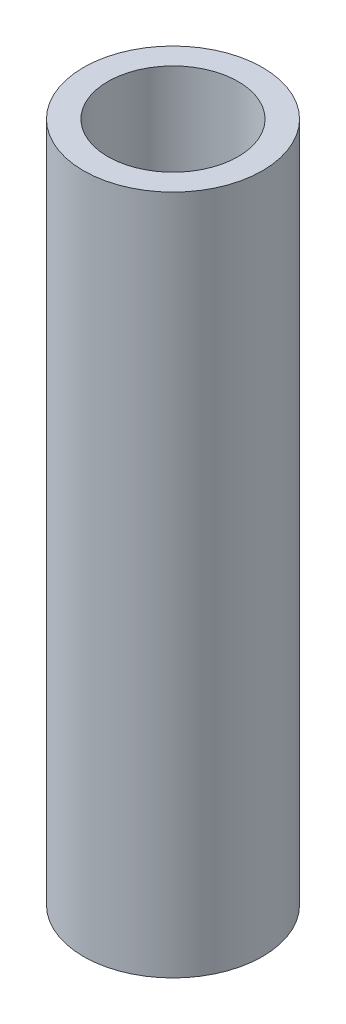
ISO-10303-21;
HEADER;
FILE_DESCRIPTION(('STEP AP214'),'2;1');
FILE_NAME('part.step','',(''),(''),'','','');
FILE_SCHEMA(('AUTOMOTIVE_DESIGN { 1 0 10303 214 1 1 1 1 }'));
ENDSEC;
DATA;
#1=APPLICATION_CONTEXT('core data for automotive mechanical design processes');
#2=APPLICATION_PROTOCOL_DEFINITION('international standard','automotive_design',2000,#1);
#3=PRODUCT_CONTEXT('',#1,'mechanical');
#4=PRODUCT('Part','Part','',(#3));
#5=PRODUCT_RELATED_PRODUCT_CATEGORY('part','',(#4));
#6=PRODUCT_DEFINITION_FORMATION('','',#4);
#7=PRODUCT_DEFINITION_CONTEXT('part definition',#1,'design');
#8=PRODUCT_DEFINITION('design','',#6,#7);
#9=PRODUCT_DEFINITION_SHAPE('','',#8);
#10=(LENGTH_UNIT() NAMED_UNIT(*) SI_UNIT(.MILLI.,.METRE.));
#11=(NAMED_UNIT(*) PLANE_ANGLE_UNIT() SI_UNIT($,.RADIAN.));
#12=(NAMED_UNIT(*) SI_UNIT($,.STERADIAN.) SOLID_ANGLE_UNIT());
#13=UNCERTAINTY_MEASURE_WITH_UNIT(LENGTH_MEASURE(1.E-05),#10,'distance_accuracy_value','');
#14=(GEOMETRIC_REPRESENTATION_CONTEXT(3) GLOBAL_UNCERTAINTY_ASSIGNED_CONTEXT((#13)) GLOBAL_UNIT_ASSIGNED_CONTEXT((#10,
#11,#12)) REPRESENTATION_CONTEXT('',''));
#15=CARTESIAN_POINT('',(0.,0.,0.));
#16=DIRECTION('',(0.,0.,1.));
#17=DIRECTION('',(1.,0.,0.));
#18=AXIS2_PLACEMENT_3D('',#15,#16,#17);
#19=CARTESIAN_POINT('',(0.,127.,0.));
#20=DIRECTION('',(0.,1.,0.));
#21=DIRECTION('',(0.,0.,1.));
#22=AXIS2_PLACEMENT_3D('',#19,#20,#21);
#23=PLANE('',#22);
#24=CARTESIAN_POINT('',(0.,127.,0.));
#25=DIRECTION('',(0.,1.,0.));
#26=DIRECTION('',(0.,0.,1.));
#27=AXIS2_PLACEMENT_3D('',#24,#25,#26);
#28=CIRCLE('',#27,33.401);
#29=CARTESIAN_POINT('',(0.,127.,33.401));
#30=VERTEX_POINT('',#29);
#31=EDGE_CURVE('E10',#30,#30,#28,.T.);
#32=ORIENTED_EDGE('',*,*,#31,.T.);
#33=EDGE_LOOP('',(#32));
#34=FACE_BOUND('',#33,.T.);
#35=CARTESIAN_POINT('',(0.,127.,0.));
#36=DIRECTION('',(0.,1.,0.));
#37=DIRECTION('',(0.,0.,1.));
#38=AXIS2_PLACEMENT_3D('',#35,#36,#37);
#39=CIRCLE('',#38,24.3078);
#40=CARTESIAN_POINT('',(0.,127.,24.3078));
#41=VERTEX_POINT('',#40);
#42=EDGE_CURVE('E42',#41,#41,#39,.T.);
#43=ORIENTED_EDGE('',*,*,#42,.F.);
#44=EDGE_LOOP('',(#43));
#45=FACE_BOUND('',#44,.T.);
#46=ADVANCED_FACE('F31',(#34,#45),#23,.T.);
#47=CARTESIAN_POINT('',(0.,-127.,0.));
#48=DIRECTION('',(0.,1.,0.));
#49=DIRECTION('',(0.,0.,1.));
#50=AXIS2_PLACEMENT_3D('',#47,#48,#49);
#51=PLANE('',#50);
#52=CARTESIAN_POINT('',(0.,-127.,0.));
#53=DIRECTION('',(0.,1.,0.));
#54=DIRECTION('',(0.,0.,1.));
#55=AXIS2_PLACEMENT_3D('',#52,#53,#54);
#56=CIRCLE('',#55,33.401);
#57=CARTESIAN_POINT('',(0.,-127.,33.401));
#58=VERTEX_POINT('',#57);
#59=EDGE_CURVE('E35',#58,#58,#56,.T.);
#60=ORIENTED_EDGE('',*,*,#59,.F.);
#61=EDGE_LOOP('',(#60));
#62=FACE_BOUND('',#61,.T.);
#63=CARTESIAN_POINT('',(0.,-127.,0.));
#64=DIRECTION('',(0.,1.,0.));
#65=DIRECTION('',(0.,0.,1.));
#66=AXIS2_PLACEMENT_3D('',#63,#64,#65);
#67=CIRCLE('',#66,24.3078);
#68=CARTESIAN_POINT('',(0.,-127.,24.3078));
#69=VERTEX_POINT('',#68);
#70=EDGE_CURVE('E44',#69,#69,#67,.T.);
#71=ORIENTED_EDGE('',*,*,#70,.T.);
#72=EDGE_LOOP('',(#71));
#73=FACE_BOUND('',#72,.T.);
#74=ADVANCED_FACE('F54',(#62,#73),#51,.F.);
#75=CARTESIAN_POINT('',(0.,127.,0.));
#76=DIRECTION('',(0.,-1.,0.));
#77=DIRECTION('',(0.,0.,-1.));
#78=AXIS2_PLACEMENT_3D('',#75,#76,#77);
#79=CYLINDRICAL_SURFACE('',#78,33.401);
#80=ORIENTED_EDGE('',*,*,#31,.F.);
#81=EDGE_LOOP('',(#80));
#82=FACE_BOUND('',#81,.T.);
#83=ORIENTED_EDGE('',*,*,#59,.T.);
#84=EDGE_LOOP('',(#83));
#85=FACE_BOUND('',#84,.T.);
#86=ADVANCED_FACE('F33',(#82,#85),#79,.T.);
#87=CARTESIAN_POINT('',(0.,127.,0.));
#88=DIRECTION('',(0.,-1.,0.));
#89=DIRECTION('',(0.,0.,-1.));
#90=AXIS2_PLACEMENT_3D('',#87,#88,#89);
#91=CYLINDRICAL_SURFACE('',#90,24.3078);
#92=ORIENTED_EDGE('',*,*,#42,.T.);
#93=EDGE_LOOP('',(#92));
#94=FACE_BOUND('',#93,.T.);
#95=ORIENTED_EDGE('',*,*,#70,.F.);
#96=EDGE_LOOP('',(#95));
#97=FACE_BOUND('',#96,.T.);
#98=ADVANCED_FACE('F50',(#94,#97),#91,.F.);
#99=CLOSED_SHELL('',(#46,#74,#86,#98));
#100=MANIFOLD_SOLID_BREP('B2',#99);
#101=ADVANCED_BREP_SHAPE_REPRESENTATION('',(#18,#100),#14);
#102=SHAPE_DEFINITION_REPRESENTATION(#9,#101);
ENDSEC;
END-ISO-10303-21;
